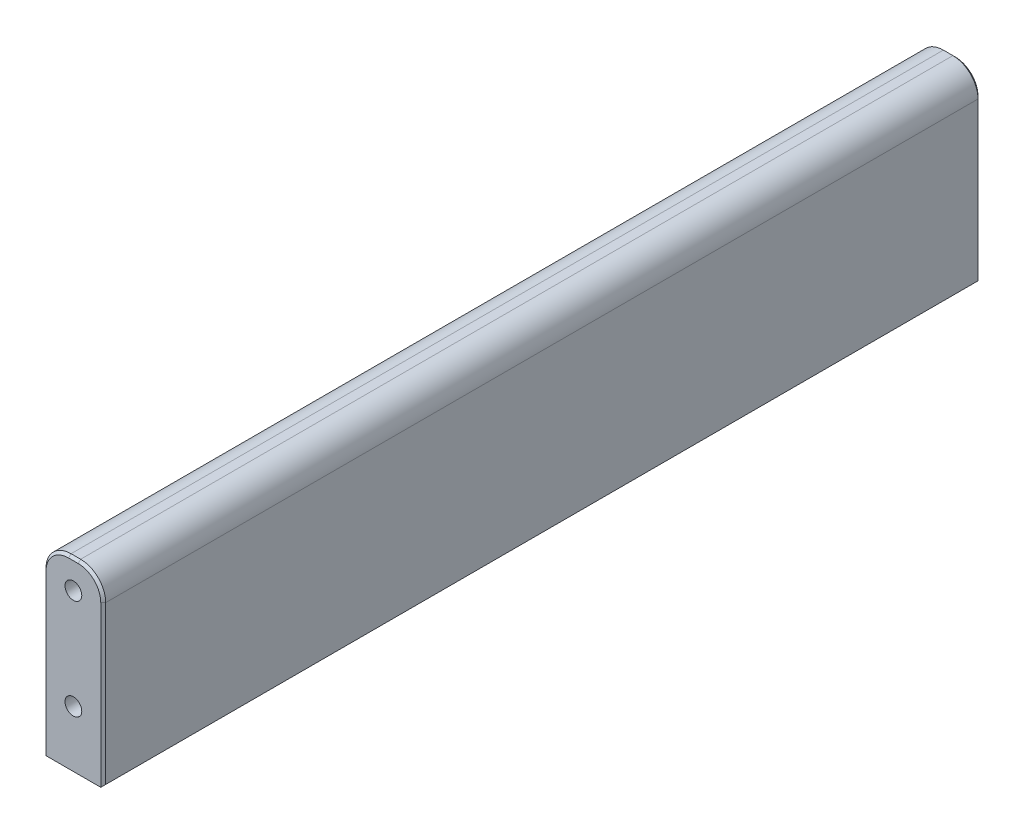
ISO-10303-21;
HEADER;
FILE_DESCRIPTION(('STEP AP214'),'2;1');
FILE_NAME('part.step','',(''),(''),'','','');
FILE_SCHEMA(('AUTOMOTIVE_DESIGN { 1 0 10303 214 1 1 1 1 }'));
ENDSEC;
DATA;
#1=APPLICATION_CONTEXT('core data for automotive mechanical design processes');
#2=APPLICATION_PROTOCOL_DEFINITION('international standard','automotive_design',2000,#1);
#3=PRODUCT_CONTEXT('',#1,'mechanical');
#4=PRODUCT('Part','Part','',(#3));
#5=PRODUCT_RELATED_PRODUCT_CATEGORY('part','',(#4));
#6=PRODUCT_DEFINITION_FORMATION('','',#4);
#7=PRODUCT_DEFINITION_CONTEXT('part definition',#1,'design');
#8=PRODUCT_DEFINITION('design','',#6,#7);
#9=PRODUCT_DEFINITION_SHAPE('','',#8);
#10=(LENGTH_UNIT() NAMED_UNIT(*) SI_UNIT(.MILLI.,.METRE.));
#11=(NAMED_UNIT(*) PLANE_ANGLE_UNIT() SI_UNIT($,.RADIAN.));
#12=(NAMED_UNIT(*) SI_UNIT($,.STERADIAN.) SOLID_ANGLE_UNIT());
#13=UNCERTAINTY_MEASURE_WITH_UNIT(LENGTH_MEASURE(1.E-05),#10,'distance_accuracy_value','');
#14=(GEOMETRIC_REPRESENTATION_CONTEXT(3) GLOBAL_UNCERTAINTY_ASSIGNED_CONTEXT((#13)) GLOBAL_UNIT_ASSIGNED_CONTEXT((#10,
#11,#12)) REPRESENTATION_CONTEXT('',''));
#15=CARTESIAN_POINT('',(0.,0.,0.));
#16=DIRECTION('',(0.,0.,1.));
#17=DIRECTION('',(1.,0.,0.));
#18=AXIS2_PLACEMENT_3D('',#15,#16,#17);
#19=CARTESIAN_POINT('',(-0.97,13.67,177.8));
#20=DIRECTION('',(0.,0.,-1.));
#21=DIRECTION('',(-1.,0.,0.));
#22=AXIS2_PLACEMENT_3D('',#19,#20,#21);
#23=PLANE('',#22);
#24=CARTESIAN_POINT('',(-0.97,13.67,177.8));
#25=DIRECTION('',(0.,0.,-1.));
#26=DIRECTION('',(-1.,0.,0.));
#27=AXIS2_PLACEMENT_3D('',#24,#25,#26);
#28=CIRCLE('',#27,4.58);
#29=CARTESIAN_POINT('',(-0.970000000000001,18.25,177.8));
#30=VERTEX_POINT('',#29);
#31=CARTESIAN_POINT('',(-5.55,13.67,177.8));
#32=VERTEX_POINT('',#31);
#33=EDGE_CURVE('E153',#30,#32,#28,.F.);
#34=ORIENTED_EDGE('',*,*,#33,.T.);
#35=DIRECTION('',(0.,-1.,0.));
#36=VECTOR('',#35,1.);
#37=CARTESIAN_POINT('',(-5.55,13.67,177.8));
#38=LINE('',#37,#36);
#39=CARTESIAN_POINT('',(-5.55000000000002,-18.75,177.8));
#40=VERTEX_POINT('',#39);
#41=EDGE_CURVE('E131',#32,#40,#38,.T.);
#42=ORIENTED_EDGE('',*,*,#41,.T.);
#43=DIRECTION('',(1.,0.,0.));
#44=VECTOR('',#43,1.);
#45=CARTESIAN_POINT('',(-6.05,-18.75,177.8));
#46=LINE('',#45,#44);
#47=CARTESIAN_POINT('',(5.55,-18.75,177.8));
#48=VERTEX_POINT('',#47);
#49=EDGE_CURVE('E150',#40,#48,#46,.T.);
#50=ORIENTED_EDGE('',*,*,#49,.T.);
#51=DIRECTION('',(0.,1.,0.));
#52=VECTOR('',#51,1.);
#53=CARTESIAN_POINT('',(5.55,13.67,177.8));
#54=LINE('',#53,#52);
#55=CARTESIAN_POINT('',(5.55,13.67,177.8));
#56=VERTEX_POINT('',#55);
#57=EDGE_CURVE('E179',#48,#56,#54,.T.);
#58=ORIENTED_EDGE('',*,*,#57,.T.);
#59=CARTESIAN_POINT('',(0.969999999999999,13.67,177.8));
#60=DIRECTION('',(0.,0.,-1.));
#61=DIRECTION('',(-1.,0.,0.));
#62=AXIS2_PLACEMENT_3D('',#59,#60,#61);
#63=CIRCLE('',#62,4.58);
#64=CARTESIAN_POINT('',(0.969999999999999,18.25,177.8));
#65=VERTEX_POINT('',#64);
#66=EDGE_CURVE('E181',#56,#65,#63,.F.);
#67=ORIENTED_EDGE('',*,*,#66,.T.);
#68=DIRECTION('',(-1.,0.,0.));
#69=VECTOR('',#68,1.);
#70=CARTESIAN_POINT('',(-0.97,18.25,177.8));
#71=LINE('',#70,#69);
#72=EDGE_CURVE('E183',#65,#30,#71,.T.);
#73=ORIENTED_EDGE('',*,*,#72,.T.);
#74=EDGE_LOOP('',(#34,#42,#50,#58,#67,#73));
#75=FACE_BOUND('',#74,.T.);
#76=CARTESIAN_POINT('',(0.,13.,177.8));
#77=DIRECTION('',(0.,0.,1.));
#78=DIRECTION('',(1.,0.,0.));
#79=AXIS2_PLACEMENT_3D('',#76,#77,#78);
#80=CIRCLE('',#79,1.7);
#81=CARTESIAN_POINT('',(1.7,13.,177.8));
#82=VERTEX_POINT('',#81);
#83=EDGE_CURVE('E165',#82,#82,#80,.T.);
#84=ORIENTED_EDGE('',*,*,#83,.F.);
#85=EDGE_LOOP('',(#84));
#86=FACE_BOUND('',#85,.T.);
#87=CARTESIAN_POINT('',(0.,-7.32,177.8));
#88=DIRECTION('',(0.,0.,1.));
#89=DIRECTION('',(1.,0.,0.));
#90=AXIS2_PLACEMENT_3D('',#87,#88,#89);
#91=CIRCLE('',#90,1.7);
#92=CARTESIAN_POINT('',(1.7,-7.32,177.8));
#93=VERTEX_POINT('',#92);
#94=EDGE_CURVE('E249',#93,#93,#91,.T.);
#95=ORIENTED_EDGE('',*,*,#94,.F.);
#96=EDGE_LOOP('',(#95));
#97=FACE_BOUND('',#96,.T.);
#98=ADVANCED_FACE('F36',(#75,#86,#97),#23,.F.);
#99=CARTESIAN_POINT('',(-0.97,13.67,0.));
#100=DIRECTION('',(0.,0.,-1.));
#101=DIRECTION('',(-1.,0.,0.));
#102=AXIS2_PLACEMENT_3D('',#99,#100,#101);
#103=PLANE('',#102);
#104=CARTESIAN_POINT('',(0.,13.,0.));
#105=DIRECTION('',(0.,0.,1.));
#106=DIRECTION('',(1.,0.,0.));
#107=AXIS2_PLACEMENT_3D('',#104,#105,#106);
#108=CIRCLE('',#107,1.7);
#109=CARTESIAN_POINT('',(1.7,13.,0.));
#110=VERTEX_POINT('',#109);
#111=EDGE_CURVE('E168',#110,#110,#108,.T.);
#112=ORIENTED_EDGE('',*,*,#111,.T.);
#113=EDGE_LOOP('',(#112));
#114=FACE_BOUND('',#113,.T.);
#115=DIRECTION('',(1.,0.,0.));
#116=VECTOR('',#115,1.);
#117=CARTESIAN_POINT('',(-6.05,-18.75,0.));
#118=LINE('',#117,#116);
#119=CARTESIAN_POINT('',(-5.55000000000002,-18.75,0.));
#120=VERTEX_POINT('',#119);
#121=CARTESIAN_POINT('',(5.55,-18.75,0.));
#122=VERTEX_POINT('',#121);
#123=EDGE_CURVE('E160',#120,#122,#118,.T.);
#124=ORIENTED_EDGE('',*,*,#123,.F.);
#125=DIRECTION('',(0.,1.,0.));
#126=VECTOR('',#125,1.);
#127=CARTESIAN_POINT('',(-5.55,13.67,0.));
#128=LINE('',#127,#126);
#129=CARTESIAN_POINT('',(-5.55,13.67,0.));
#130=VERTEX_POINT('',#129);
#131=EDGE_CURVE('E198',#120,#130,#128,.T.);
#132=ORIENTED_EDGE('',*,*,#131,.T.);
#133=CARTESIAN_POINT('',(-0.97,13.67,0.));
#134=DIRECTION('',(0.,0.,-1.));
#135=DIRECTION('',(-1.,0.,0.));
#136=AXIS2_PLACEMENT_3D('',#133,#134,#135);
#137=CIRCLE('',#136,4.58);
#138=CARTESIAN_POINT('',(-0.970000000000001,18.25,0.));
#139=VERTEX_POINT('',#138);
#140=EDGE_CURVE('E196',#130,#139,#137,.T.);
#141=ORIENTED_EDGE('',*,*,#140,.T.);
#142=DIRECTION('',(1.,0.,0.));
#143=VECTOR('',#142,1.);
#144=CARTESIAN_POINT('',(0.969999999999999,18.25,0.));
#145=LINE('',#144,#143);
#146=CARTESIAN_POINT('',(0.969999999999999,18.25,0.));
#147=VERTEX_POINT('',#146);
#148=EDGE_CURVE('E194',#139,#147,#145,.T.);
#149=ORIENTED_EDGE('',*,*,#148,.T.);
#150=CARTESIAN_POINT('',(0.969999999999999,13.67,0.));
#151=DIRECTION('',(0.,0.,-1.));
#152=DIRECTION('',(-1.,0.,0.));
#153=AXIS2_PLACEMENT_3D('',#150,#151,#152);
#154=CIRCLE('',#153,4.58);
#155=CARTESIAN_POINT('',(5.55,13.67,0.));
#156=VERTEX_POINT('',#155);
#157=EDGE_CURVE('E192',#147,#156,#154,.T.);
#158=ORIENTED_EDGE('',*,*,#157,.T.);
#159=DIRECTION('',(0.,-1.,0.));
#160=VECTOR('',#159,1.);
#161=CARTESIAN_POINT('',(5.55,-18.75,0.));
#162=LINE('',#161,#160);
#163=EDGE_CURVE('E190',#156,#122,#162,.T.);
#164=ORIENTED_EDGE('',*,*,#163,.T.);
#165=EDGE_LOOP('',(#124,#132,#141,#149,#158,#164));
#166=FACE_BOUND('',#165,.T.);
#167=CARTESIAN_POINT('',(0.,-7.32,0.));
#168=DIRECTION('',(0.,0.,1.));
#169=DIRECTION('',(1.,0.,0.));
#170=AXIS2_PLACEMENT_3D('',#167,#168,#169);
#171=CIRCLE('',#170,1.7);
#172=CARTESIAN_POINT('',(1.7,-7.32,0.));
#173=VERTEX_POINT('',#172);
#174=EDGE_CURVE('E245',#173,#173,#171,.T.);
#175=ORIENTED_EDGE('',*,*,#174,.T.);
#176=EDGE_LOOP('',(#175));
#177=FACE_BOUND('',#176,.T.);
#178=ADVANCED_FACE('F261',(#114,#166,#177),#103,.T.);
#179=CARTESIAN_POINT('',(6.05,13.67,177.8));
#180=DIRECTION('',(-1.,0.,0.));
#181=DIRECTION('',(0.,-1.,0.));
#182=AXIS2_PLACEMENT_3D('',#179,#180,#181);
#183=PLANE('',#182);
#184=DIRECTION('',(0.,0.,-1.));
#185=VECTOR('',#184,1.);
#186=CARTESIAN_POINT('',(6.05,13.67,177.8));
#187=LINE('',#186,#185);
#188=CARTESIAN_POINT('',(6.05,13.67,177.3));
#189=VERTEX_POINT('',#188);
#190=CARTESIAN_POINT('',(6.05,13.67,0.5));
#191=VERTEX_POINT('',#190);
#192=EDGE_CURVE('E176',#189,#191,#187,.T.);
#193=ORIENTED_EDGE('',*,*,#192,.F.);
#194=DIRECTION('',(0.,-1.,0.));
#195=VECTOR('',#194,1.);
#196=CARTESIAN_POINT('',(6.05,13.67,177.3));
#197=LINE('',#196,#195);
#198=CARTESIAN_POINT('',(6.05,-18.25,177.3));
#199=VERTEX_POINT('',#198);
#200=EDGE_CURVE('E54',#189,#199,#197,.T.);
#201=ORIENTED_EDGE('',*,*,#200,.T.);
#202=DIRECTION('',(0.,0.,-1.));
#203=VECTOR('',#202,1.);
#204=CARTESIAN_POINT('',(6.05,-18.25,177.8));
#205=LINE('',#204,#203);
#206=CARTESIAN_POINT('',(6.05,-18.25,0.5));
#207=VERTEX_POINT('',#206);
#208=EDGE_CURVE('E58',#199,#207,#205,.T.);
#209=ORIENTED_EDGE('',*,*,#208,.T.);
#210=DIRECTION('',(0.,1.,0.));
#211=VECTOR('',#210,1.);
#212=CARTESIAN_POINT('',(6.05,13.67,0.5));
#213=LINE('',#212,#211);
#214=EDGE_CURVE('E212',#207,#191,#213,.T.);
#215=ORIENTED_EDGE('',*,*,#214,.T.);
#216=EDGE_LOOP('',(#193,#201,#209,#215));
#217=FACE_BOUND('',#216,.T.);
#218=ADVANCED_FACE('F281',(#217),#183,.F.);
#219=CARTESIAN_POINT('',(0.969999999999999,13.67,177.8));
#220=DIRECTION('',(0.,0.,-1.));
#221=DIRECTION('',(-1.,0.,0.));
#222=AXIS2_PLACEMENT_3D('',#219,#220,#221);
#223=CYLINDRICAL_SURFACE('',#222,5.08);
#224=DIRECTION('',(0.,0.,-1.));
#225=VECTOR('',#224,1.);
#226=CARTESIAN_POINT('',(0.969999999999999,18.75,177.8));
#227=LINE('',#226,#225);
#228=CARTESIAN_POINT('',(0.969999999999999,18.75,177.3));
#229=VERTEX_POINT('',#228);
#230=CARTESIAN_POINT('',(0.969999999999999,18.75,0.5));
#231=VERTEX_POINT('',#230);
#232=EDGE_CURVE('E173',#229,#231,#227,.T.);
#233=ORIENTED_EDGE('',*,*,#232,.F.);
#234=CARTESIAN_POINT('',(0.969999999999999,13.67,177.3));
#235=DIRECTION('',(0.,0.,-1.));
#236=DIRECTION('',(-1.,0.,0.));
#237=AXIS2_PLACEMENT_3D('',#234,#235,#236);
#238=CIRCLE('',#237,5.08);
#239=EDGE_CURVE('E210',#229,#189,#238,.T.);
#240=ORIENTED_EDGE('',*,*,#239,.T.);
#241=ORIENTED_EDGE('',*,*,#192,.T.);
#242=CARTESIAN_POINT('',(0.969999999999999,13.67,0.5));
#243=DIRECTION('',(0.,0.,-1.));
#244=DIRECTION('',(-1.,0.,0.));
#245=AXIS2_PLACEMENT_3D('',#242,#243,#244);
#246=CIRCLE('',#245,5.08);
#247=EDGE_CURVE('E208',#191,#231,#246,.F.);
#248=ORIENTED_EDGE('',*,*,#247,.T.);
#249=EDGE_LOOP('',(#233,#240,#241,#248));
#250=FACE_BOUND('',#249,.T.);
#251=ADVANCED_FACE('F294',(#250),#223,.T.);
#252=CARTESIAN_POINT('',(-0.97,18.75,177.8));
#253=DIRECTION('',(0.,-1.,0.));
#254=DIRECTION('',(0.,0.,-1.));
#255=AXIS2_PLACEMENT_3D('',#252,#253,#254);
#256=PLANE('',#255);
#257=DIRECTION('',(0.,0.,-1.));
#258=VECTOR('',#257,1.);
#259=CARTESIAN_POINT('',(-0.970000000000001,18.75,177.8));
#260=LINE('',#259,#258);
#261=CARTESIAN_POINT('',(-0.970000000000001,18.75,177.3));
#262=VERTEX_POINT('',#261);
#263=CARTESIAN_POINT('',(-0.970000000000001,18.75,0.5));
#264=VERTEX_POINT('',#263);
#265=EDGE_CURVE('E163',#262,#264,#260,.T.);
#266=ORIENTED_EDGE('',*,*,#265,.F.);
#267=DIRECTION('',(1.,0.,0.));
#268=VECTOR('',#267,1.);
#269=CARTESIAN_POINT('',(-0.97,18.75,177.3));
#270=LINE('',#269,#268);
#271=EDGE_CURVE('E206',#262,#229,#270,.T.);
#272=ORIENTED_EDGE('',*,*,#271,.T.);
#273=ORIENTED_EDGE('',*,*,#232,.T.);
#274=DIRECTION('',(-1.,0.,0.));
#275=VECTOR('',#274,1.);
#276=CARTESIAN_POINT('',(-0.970000000000001,18.75,0.5));
#277=LINE('',#276,#275);
#278=EDGE_CURVE('E204',#231,#264,#277,.T.);
#279=ORIENTED_EDGE('',*,*,#278,.T.);
#280=EDGE_LOOP('',(#266,#272,#273,#279));
#281=FACE_BOUND('',#280,.T.);
#282=ADVANCED_FACE('F290',(#281),#256,.F.);
#283=CARTESIAN_POINT('',(-0.97,13.67,177.8));
#284=DIRECTION('',(0.,0.,-1.));
#285=DIRECTION('',(-1.,0.,0.));
#286=AXIS2_PLACEMENT_3D('',#283,#284,#285);
#287=CYLINDRICAL_SURFACE('',#286,5.08);
#288=DIRECTION('',(0.,0.,-1.));
#289=VECTOR('',#288,1.);
#290=CARTESIAN_POINT('',(-6.05,13.67,177.8));
#291=LINE('',#290,#289);
#292=CARTESIAN_POINT('',(-6.05,13.67,177.3));
#293=VERTEX_POINT('',#292);
#294=CARTESIAN_POINT('',(-6.05,13.67,0.5));
#295=VERTEX_POINT('',#294);
#296=EDGE_CURVE('E159',#293,#295,#291,.T.);
#297=ORIENTED_EDGE('',*,*,#296,.F.);
#298=CARTESIAN_POINT('',(-0.97,13.67,177.3));
#299=DIRECTION('',(0.,0.,-1.));
#300=DIRECTION('',(-1.,0.,0.));
#301=AXIS2_PLACEMENT_3D('',#298,#299,#300);
#302=CIRCLE('',#301,5.08);
#303=EDGE_CURVE('E202',#293,#262,#302,.T.);
#304=ORIENTED_EDGE('',*,*,#303,.T.);
#305=ORIENTED_EDGE('',*,*,#265,.T.);
#306=CARTESIAN_POINT('',(-0.97,13.67,0.5));
#307=DIRECTION('',(0.,0.,-1.));
#308=DIRECTION('',(-1.,0.,0.));
#309=AXIS2_PLACEMENT_3D('',#306,#307,#308);
#310=CIRCLE('',#309,5.08);
#311=EDGE_CURVE('E200',#264,#295,#310,.F.);
#312=ORIENTED_EDGE('',*,*,#311,.T.);
#313=EDGE_LOOP('',(#297,#304,#305,#312));
#314=FACE_BOUND('',#313,.T.);
#315=ADVANCED_FACE('F286',(#314),#287,.T.);
#316=CARTESIAN_POINT('',(-6.05,13.67,177.8));
#317=DIRECTION('',(1.,0.,0.));
#318=DIRECTION('',(0.,1.,0.));
#319=AXIS2_PLACEMENT_3D('',#316,#317,#318);
#320=PLANE('',#319);
#321=DIRECTION('',(0.,0.,1.));
#322=VECTOR('',#321,1.);
#323=CARTESIAN_POINT('',(-6.05,-18.25,177.8));
#324=LINE('',#323,#322);
#325=CARTESIAN_POINT('',(-6.05,-18.25,0.5));
#326=VERTEX_POINT('',#325);
#327=CARTESIAN_POINT('',(-6.05,-18.25,177.3));
#328=VERTEX_POINT('',#327);
#329=EDGE_CURVE('E155',#326,#328,#324,.T.);
#330=ORIENTED_EDGE('',*,*,#329,.T.);
#331=DIRECTION('',(0.,1.,0.));
#332=VECTOR('',#331,1.);
#333=CARTESIAN_POINT('',(-6.05,13.67,177.3));
#334=LINE('',#333,#332);
#335=EDGE_CURVE('E133',#328,#293,#334,.T.);
#336=ORIENTED_EDGE('',*,*,#335,.T.);
#337=ORIENTED_EDGE('',*,*,#296,.T.);
#338=DIRECTION('',(0.,-1.,0.));
#339=VECTOR('',#338,1.);
#340=CARTESIAN_POINT('',(-6.05,-18.75,0.5));
#341=LINE('',#340,#339);
#342=EDGE_CURVE('E187',#295,#326,#341,.T.);
#343=ORIENTED_EDGE('',*,*,#342,.T.);
#344=EDGE_LOOP('',(#330,#336,#337,#343));
#345=FACE_BOUND('',#344,.T.);
#346=ADVANCED_FACE('F274',(#345),#320,.F.);
#347=CARTESIAN_POINT('',(-6.05,-18.75,177.8));
#348=DIRECTION('',(0.,1.,0.));
#349=DIRECTION('',(0.,0.,1.));
#350=AXIS2_PLACEMENT_3D('',#347,#348,#349);
#351=PLANE('',#350);
#352=ORIENTED_EDGE('',*,*,#123,.T.);
#353=DIRECTION('',(0.,0.,1.));
#354=VECTOR('',#353,1.);
#355=CARTESIAN_POINT('',(5.55,-18.75,177.8));
#356=LINE('',#355,#354);
#357=EDGE_CURVE('E11',#122,#48,#356,.T.);
#358=ORIENTED_EDGE('',*,*,#357,.T.);
#359=ORIENTED_EDGE('',*,*,#49,.F.);
#360=DIRECTION('',(0.,0.,-1.));
#361=VECTOR('',#360,1.);
#362=CARTESIAN_POINT('',(-5.55000000000002,-18.75,177.8));
#363=LINE('',#362,#361);
#364=EDGE_CURVE('E46',#40,#120,#363,.T.);
#365=ORIENTED_EDGE('',*,*,#364,.T.);
#366=EDGE_LOOP('',(#352,#358,#359,#365));
#367=FACE_BOUND('',#366,.T.);
#368=ADVANCED_FACE('F157',(#367),#351,.F.);
#369=CARTESIAN_POINT('',(0.,13.,177.8));
#370=DIRECTION('',(0.,0.,-1.));
#371=DIRECTION('',(-1.,0.,0.));
#372=AXIS2_PLACEMENT_3D('',#369,#370,#371);
#373=CYLINDRICAL_SURFACE('',#372,1.7);
#374=ORIENTED_EDGE('',*,*,#83,.T.);
#375=EDGE_LOOP('',(#374));
#376=FACE_BOUND('',#375,.T.);
#377=ORIENTED_EDGE('',*,*,#111,.F.);
#378=EDGE_LOOP('',(#377));
#379=FACE_BOUND('',#378,.T.);
#380=ADVANCED_FACE('F264',(#376,#379),#373,.F.);
#381=CARTESIAN_POINT('',(0.,-7.32,177.8));
#382=DIRECTION('',(0.,0.,-1.));
#383=DIRECTION('',(-1.,0.,0.));
#384=AXIS2_PLACEMENT_3D('',#381,#382,#383);
#385=CYLINDRICAL_SURFACE('',#384,1.7);
#386=ORIENTED_EDGE('',*,*,#94,.T.);
#387=EDGE_LOOP('',(#386));
#388=FACE_BOUND('',#387,.T.);
#389=ORIENTED_EDGE('',*,*,#174,.F.);
#390=EDGE_LOOP('',(#389));
#391=FACE_BOUND('',#390,.T.);
#392=ADVANCED_FACE('F266',(#388,#391),#385,.F.);
#393=CARTESIAN_POINT('',(6.05,13.67,0.5));
#394=DIRECTION('',(0.707106781186547,0.,-0.707106781186547));
#395=DIRECTION('',(0.,-1.,0.));
#396=AXIS2_PLACEMENT_3D('',#393,#394,#395);
#397=PLANE('',#396);
#398=DIRECTION('',(-0.707106781186547,0.,-0.707106781186547));
#399=VECTOR('',#398,1.);
#400=CARTESIAN_POINT('',(6.05,13.67,0.5));
#401=LINE('',#400,#399);
#402=EDGE_CURVE('E238',#191,#156,#401,.T.);
#403=ORIENTED_EDGE('',*,*,#402,.F.);
#404=ORIENTED_EDGE('',*,*,#214,.F.);
#405=DIRECTION('',(0.577350269189626,0.577350269189626,0.577350269189626));
#406=VECTOR('',#405,1.);
#407=CARTESIAN_POINT('',(16.69,-7.61000000000001,11.14));
#408=LINE('',#407,#406);
#409=EDGE_CURVE('E41',#122,#207,#408,.T.);
#410=ORIENTED_EDGE('',*,*,#409,.F.);
#411=ORIENTED_EDGE('',*,*,#163,.F.);
#412=EDGE_LOOP('',(#403,#404,#410,#411));
#413=FACE_BOUND('',#412,.T.);
#414=ADVANCED_FACE('F39',(#413),#397,.T.);
#415=CARTESIAN_POINT('',(6.05,-18.25,177.8));
#416=DIRECTION('',(-0.707106781186547,0.707106781186547,0.));
#417=DIRECTION('',(0.,0.,-1.));
#418=AXIS2_PLACEMENT_3D('',#415,#416,#417);
#419=PLANE('',#418);
#420=ORIENTED_EDGE('',*,*,#409,.T.);
#421=ORIENTED_EDGE('',*,*,#208,.F.);
#422=DIRECTION('',(-0.577350269189626,-0.577350269189626,0.577350269189626));
#423=VECTOR('',#422,1.);
#424=CARTESIAN_POINT('',(5.88333333333334,-18.4166666666667,177.466666666667));
#425=LINE('',#424,#423);
#426=EDGE_CURVE('E236',#48,#199,#425,.F.);
#427=ORIENTED_EDGE('',*,*,#426,.F.);
#428=ORIENTED_EDGE('',*,*,#357,.F.);
#429=EDGE_LOOP('',(#420,#421,#427,#428));
#430=FACE_BOUND('',#429,.T.);
#431=ADVANCED_FACE('F366',(#430),#419,.F.);
#432=CARTESIAN_POINT('',(0.969999999999999,13.67,0.5));
#433=DIRECTION('',(0.,0.,1.));
#434=DIRECTION('',(1.,0.,0.));
#435=AXIS2_PLACEMENT_3D('',#432,#433,#434);
#436=CONICAL_SURFACE('',#435,5.08,0.785398163397448);
#437=ORIENTED_EDGE('',*,*,#402,.T.);
#438=ORIENTED_EDGE('',*,*,#157,.F.);
#439=DIRECTION('',(0.,-0.707106781186547,-0.707106781186547));
#440=VECTOR('',#439,1.);
#441=CARTESIAN_POINT('',(0.969999999999999,18.75,0.5));
#442=LINE('',#441,#440);
#443=EDGE_CURVE('E233',#231,#147,#442,.T.);
#444=ORIENTED_EDGE('',*,*,#443,.F.);
#445=ORIENTED_EDGE('',*,*,#247,.F.);
#446=EDGE_LOOP('',(#437,#438,#444,#445));
#447=FACE_BOUND('',#446,.T.);
#448=ADVANCED_FACE('F360',(#447),#436,.T.);
#449=CARTESIAN_POINT('',(5.55,13.67,177.8));
#450=DIRECTION('',(-0.707106781186547,0.,-0.707106781186547));
#451=DIRECTION('',(0.,1.,0.));
#452=AXIS2_PLACEMENT_3D('',#449,#450,#451);
#453=PLANE('',#452);
#454=ORIENTED_EDGE('',*,*,#426,.T.);
#455=ORIENTED_EDGE('',*,*,#200,.F.);
#456=DIRECTION('',(0.707106781186547,0.,-0.707106781186547));
#457=VECTOR('',#456,1.);
#458=CARTESIAN_POINT('',(5.55,13.67,177.8));
#459=LINE('',#458,#457);
#460=EDGE_CURVE('E230',#56,#189,#459,.T.);
#461=ORIENTED_EDGE('',*,*,#460,.F.);
#462=ORIENTED_EDGE('',*,*,#57,.F.);
#463=EDGE_LOOP('',(#454,#455,#461,#462));
#464=FACE_BOUND('',#463,.T.);
#465=ADVANCED_FACE('F353',(#464),#453,.F.);
#466=CARTESIAN_POINT('',(-0.97,18.75,0.5));
#467=DIRECTION('',(0.,0.707106781186547,-0.707106781186547));
#468=DIRECTION('',(1.,0.,0.));
#469=AXIS2_PLACEMENT_3D('',#466,#467,#468);
#470=PLANE('',#469);
#471=ORIENTED_EDGE('',*,*,#443,.T.);
#472=ORIENTED_EDGE('',*,*,#148,.F.);
#473=DIRECTION('',(0.,-0.707106781186547,-0.707106781186547));
#474=VECTOR('',#473,1.);
#475=CARTESIAN_POINT('',(-0.970000000000001,18.75,0.5));
#476=LINE('',#475,#474);
#477=EDGE_CURVE('E227',#264,#139,#476,.T.);
#478=ORIENTED_EDGE('',*,*,#477,.F.);
#479=ORIENTED_EDGE('',*,*,#278,.F.);
#480=EDGE_LOOP('',(#471,#472,#478,#479));
#481=FACE_BOUND('',#480,.T.);
#482=ADVANCED_FACE('F346',(#481),#470,.T.);
#483=CARTESIAN_POINT('',(0.969999999999999,13.67,177.8));
#484=DIRECTION('',(0.,0.,-1.));
#485=DIRECTION('',(-1.,0.,0.));
#486=AXIS2_PLACEMENT_3D('',#483,#484,#485);
#487=CONICAL_SURFACE('',#486,4.58,0.785398163397448);
#488=ORIENTED_EDGE('',*,*,#460,.T.);
#489=ORIENTED_EDGE('',*,*,#239,.F.);
#490=DIRECTION('',(0.,0.707106781186547,-0.707106781186547));
#491=VECTOR('',#490,1.);
#492=CARTESIAN_POINT('',(0.969999999999999,18.25,177.8));
#493=LINE('',#492,#491);
#494=EDGE_CURVE('E224',#65,#229,#493,.T.);
#495=ORIENTED_EDGE('',*,*,#494,.F.);
#496=ORIENTED_EDGE('',*,*,#66,.F.);
#497=EDGE_LOOP('',(#488,#489,#495,#496));
#498=FACE_BOUND('',#497,.T.);
#499=ADVANCED_FACE('F339',(#498),#487,.T.);
#500=CARTESIAN_POINT('',(-0.97,13.67,0.5));
#501=DIRECTION('',(0.,0.,1.));
#502=DIRECTION('',(1.,0.,0.));
#503=AXIS2_PLACEMENT_3D('',#500,#501,#502);
#504=CONICAL_SURFACE('',#503,5.08,0.785398163397448);
#505=ORIENTED_EDGE('',*,*,#477,.T.);
#506=ORIENTED_EDGE('',*,*,#140,.F.);
#507=DIRECTION('',(0.707106781186547,0.,-0.707106781186547));
#508=VECTOR('',#507,1.);
#509=CARTESIAN_POINT('',(-6.05,13.67,0.5));
#510=LINE('',#509,#508);
#511=EDGE_CURVE('E221',#295,#130,#510,.T.);
#512=ORIENTED_EDGE('',*,*,#511,.F.);
#513=ORIENTED_EDGE('',*,*,#311,.F.);
#514=EDGE_LOOP('',(#505,#506,#512,#513));
#515=FACE_BOUND('',#514,.T.);
#516=ADVANCED_FACE('F332',(#515),#504,.T.);
#517=CARTESIAN_POINT('',(-0.97,18.25,177.8));
#518=DIRECTION('',(0.,-0.707106781186547,-0.707106781186547));
#519=DIRECTION('',(-1.,0.,0.));
#520=AXIS2_PLACEMENT_3D('',#517,#518,#519);
#521=PLANE('',#520);
#522=ORIENTED_EDGE('',*,*,#494,.T.);
#523=ORIENTED_EDGE('',*,*,#271,.F.);
#524=DIRECTION('',(0.,0.707106781186547,-0.707106781186547));
#525=VECTOR('',#524,1.);
#526=CARTESIAN_POINT('',(-0.970000000000001,18.25,177.8));
#527=LINE('',#526,#525);
#528=EDGE_CURVE('E218',#30,#262,#527,.T.);
#529=ORIENTED_EDGE('',*,*,#528,.F.);
#530=ORIENTED_EDGE('',*,*,#72,.F.);
#531=EDGE_LOOP('',(#522,#523,#529,#530));
#532=FACE_BOUND('',#531,.T.);
#533=ADVANCED_FACE('F325',(#532),#521,.F.);
#534=CARTESIAN_POINT('',(-6.05,13.67,0.5));
#535=DIRECTION('',(-0.707106781186547,0.,-0.707106781186547));
#536=DIRECTION('',(0.,1.,0.));
#537=AXIS2_PLACEMENT_3D('',#534,#535,#536);
#538=PLANE('',#537);
#539=ORIENTED_EDGE('',*,*,#511,.T.);
#540=ORIENTED_EDGE('',*,*,#131,.F.);
#541=DIRECTION('',(-0.577350269189626,0.577350269189626,0.577350269189626));
#542=VECTOR('',#541,1.);
#543=CARTESIAN_POINT('',(-64.8166666666667,40.5166666666666,59.2666666666667));
#544=LINE('',#543,#542);
#545=EDGE_CURVE('E141',#326,#120,#544,.F.);
#546=ORIENTED_EDGE('',*,*,#545,.F.);
#547=ORIENTED_EDGE('',*,*,#342,.F.);
#548=EDGE_LOOP('',(#539,#540,#546,#547));
#549=FACE_BOUND('',#548,.T.);
#550=ADVANCED_FACE('F318',(#549),#538,.T.);
#551=CARTESIAN_POINT('',(-0.97,13.67,177.8));
#552=DIRECTION('',(0.,0.,-1.));
#553=DIRECTION('',(-1.,0.,0.));
#554=AXIS2_PLACEMENT_3D('',#551,#552,#553);
#555=CONICAL_SURFACE('',#554,4.58,0.785398163397448);
#556=ORIENTED_EDGE('',*,*,#528,.T.);
#557=ORIENTED_EDGE('',*,*,#303,.F.);
#558=DIRECTION('',(-0.707106781186547,0.,-0.707106781186547));
#559=VECTOR('',#558,1.);
#560=CARTESIAN_POINT('',(-5.55,13.67,177.8));
#561=LINE('',#560,#559);
#562=EDGE_CURVE('E136',#32,#293,#561,.T.);
#563=ORIENTED_EDGE('',*,*,#562,.F.);
#564=ORIENTED_EDGE('',*,*,#33,.F.);
#565=EDGE_LOOP('',(#556,#557,#563,#564));
#566=FACE_BOUND('',#565,.T.);
#567=ADVANCED_FACE('F312',(#566),#555,.T.);
#568=CARTESIAN_POINT('',(-5.55000000000002,-18.75,177.8));
#569=DIRECTION('',(0.707106781186547,0.707106781186547,0.));
#570=DIRECTION('',(0.,0.,-1.));
#571=AXIS2_PLACEMENT_3D('',#568,#569,#570);
#572=PLANE('',#571);
#573=ORIENTED_EDGE('',*,*,#545,.T.);
#574=ORIENTED_EDGE('',*,*,#364,.F.);
#575=DIRECTION('',(-0.577350269189626,0.577350269189626,-0.577350269189626));
#576=VECTOR('',#575,1.);
#577=CARTESIAN_POINT('',(-5.55000000000002,-18.75,177.8));
#578=LINE('',#577,#576);
#579=EDGE_CURVE('E127',#328,#40,#578,.F.);
#580=ORIENTED_EDGE('',*,*,#579,.F.);
#581=ORIENTED_EDGE('',*,*,#329,.F.);
#582=EDGE_LOOP('',(#573,#574,#580,#581));
#583=FACE_BOUND('',#582,.T.);
#584=ADVANCED_FACE('F139',(#583),#572,.F.);
#585=CARTESIAN_POINT('',(-5.55,13.67,177.8));
#586=DIRECTION('',(0.707106781186547,0.,-0.707106781186547));
#587=DIRECTION('',(0.,-1.,0.));
#588=AXIS2_PLACEMENT_3D('',#585,#586,#587);
#589=PLANE('',#588);
#590=ORIENTED_EDGE('',*,*,#562,.T.);
#591=ORIENTED_EDGE('',*,*,#335,.F.);
#592=ORIENTED_EDGE('',*,*,#579,.T.);
#593=ORIENTED_EDGE('',*,*,#41,.F.);
#594=EDGE_LOOP('',(#590,#591,#592,#593));
#595=FACE_BOUND('',#594,.T.);
#596=ADVANCED_FACE('F129',(#595),#589,.F.);
#597=CLOSED_SHELL('',(#98,#178,#218,#251,#282,#315,#346,#368,#380,#392,#414,#431,#448,#465,#482,
#499,#516,#533,#550,#567,#584,#596));
#598=MANIFOLD_SOLID_BREP('B2',#597);
#599=ADVANCED_BREP_SHAPE_REPRESENTATION('',(#18,#598),#14);
#600=SHAPE_DEFINITION_REPRESENTATION(#9,#599);
ENDSEC;
END-ISO-10303-21;
